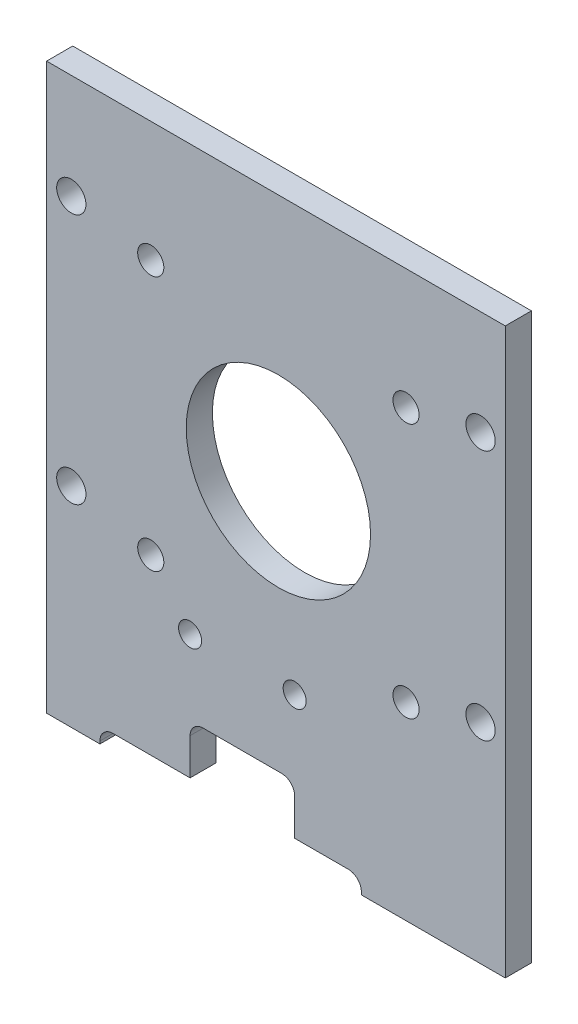
ISO-10303-21;
HEADER;
FILE_DESCRIPTION(('STEP AP214'),'2;1');
FILE_NAME('part.step','',(''),(''),'','','');
FILE_SCHEMA(('AUTOMOTIVE_DESIGN { 1 0 10303 214 1 1 1 1 }'));
ENDSEC;
DATA;
#1=APPLICATION_CONTEXT('core data for automotive mechanical design processes');
#2=APPLICATION_PROTOCOL_DEFINITION('international standard','automotive_design',2000,#1);
#3=PRODUCT_CONTEXT('',#1,'mechanical');
#4=PRODUCT('Part','Part','',(#3));
#5=PRODUCT_RELATED_PRODUCT_CATEGORY('part','',(#4));
#6=PRODUCT_DEFINITION_FORMATION('','',#4);
#7=PRODUCT_DEFINITION_CONTEXT('part definition',#1,'design');
#8=PRODUCT_DEFINITION('design','',#6,#7);
#9=PRODUCT_DEFINITION_SHAPE('','',#8);
#10=(LENGTH_UNIT() NAMED_UNIT(*) SI_UNIT(.MILLI.,.METRE.));
#11=(NAMED_UNIT(*) PLANE_ANGLE_UNIT() SI_UNIT($,.RADIAN.));
#12=(NAMED_UNIT(*) SI_UNIT($,.STERADIAN.) SOLID_ANGLE_UNIT());
#13=UNCERTAINTY_MEASURE_WITH_UNIT(LENGTH_MEASURE(1.E-05),#10,'distance_accuracy_value','');
#14=(GEOMETRIC_REPRESENTATION_CONTEXT(3) GLOBAL_UNCERTAINTY_ASSIGNED_CONTEXT((#13)) GLOBAL_UNIT_ASSIGNED_CONTEXT((#10,
#11,#12)) REPRESENTATION_CONTEXT('',''));
#15=CARTESIAN_POINT('',(0.,0.,0.));
#16=DIRECTION('',(0.,0.,1.));
#17=DIRECTION('',(1.,0.,0.));
#18=AXIS2_PLACEMENT_3D('',#15,#16,#17);
#19=CARTESIAN_POINT('',(0.,0.,3.175));
#20=DIRECTION('',(0.,1.,0.));
#21=DIRECTION('',(0.,0.,1.));
#22=AXIS2_PLACEMENT_3D('',#19,#20,#21);
#23=PLANE('',#22);
#24=DIRECTION('',(1.,0.,0.));
#25=VECTOR('',#24,1.);
#26=CARTESIAN_POINT('',(0.,0.,0.));
#27=LINE('',#26,#25);
#28=CARTESIAN_POINT('',(0.,0.,0.));
#29=VERTEX_POINT('',#28);
#30=CARTESIAN_POINT('',(6.477,0.,0.));
#31=VERTEX_POINT('',#30);
#32=EDGE_CURVE('E150',#29,#31,#27,.T.);
#33=ORIENTED_EDGE('',*,*,#32,.T.);
#34=DIRECTION('',(0.,0.,1.));
#35=VECTOR('',#34,1.);
#36=CARTESIAN_POINT('',(6.477,0.,0.));
#37=LINE('',#36,#35);
#38=CARTESIAN_POINT('',(6.477,0.,3.175));
#39=VERTEX_POINT('',#38);
#40=EDGE_CURVE('E160',#31,#39,#37,.T.);
#41=ORIENTED_EDGE('',*,*,#40,.T.);
#42=DIRECTION('',(1.,0.,0.));
#43=VECTOR('',#42,1.);
#44=CARTESIAN_POINT('',(0.,0.,3.175));
#45=LINE('',#44,#43);
#46=CARTESIAN_POINT('',(0.,0.,3.175));
#47=VERTEX_POINT('',#46);
#48=EDGE_CURVE('E290',#47,#39,#45,.T.);
#49=ORIENTED_EDGE('',*,*,#48,.F.);
#50=DIRECTION('',(0.,0.,-1.));
#51=VECTOR('',#50,1.);
#52=CARTESIAN_POINT('',(0.,0.,3.175));
#53=LINE('',#52,#51);
#54=EDGE_CURVE('E169',#47,#29,#53,.T.);
#55=ORIENTED_EDGE('',*,*,#54,.T.);
#56=EDGE_LOOP('',(#33,#41,#49,#55));
#57=FACE_BOUND('',#56,.T.);
#58=ADVANCED_FACE('F32',(#57),#23,.F.);
#59=CARTESIAN_POINT('',(0.,0.,3.175));
#60=DIRECTION('',(1.,0.,0.));
#61=DIRECTION('',(0.,0.,-1.));
#62=AXIS2_PLACEMENT_3D('',#59,#60,#61);
#63=PLANE('',#62);
#64=DIRECTION('',(0.,-1.,0.));
#65=VECTOR('',#64,1.);
#66=CARTESIAN_POINT('',(0.,0.,0.));
#67=LINE('',#66,#65);
#68=CARTESIAN_POINT('',(0.,68.58,0.));
#69=VERTEX_POINT('',#68);
#70=EDGE_CURVE('E176',#69,#29,#67,.T.);
#71=ORIENTED_EDGE('',*,*,#70,.T.);
#72=ORIENTED_EDGE('',*,*,#54,.F.);
#73=DIRECTION('',(0.,-1.,0.));
#74=VECTOR('',#73,1.);
#75=CARTESIAN_POINT('',(0.,0.,3.175));
#76=LINE('',#75,#74);
#77=CARTESIAN_POINT('',(0.,68.58,3.175));
#78=VERTEX_POINT('',#77);
#79=EDGE_CURVE('E181',#78,#47,#76,.T.);
#80=ORIENTED_EDGE('',*,*,#79,.F.);
#81=DIRECTION('',(0.,0.,-1.));
#82=VECTOR('',#81,1.);
#83=CARTESIAN_POINT('',(0.,68.58,3.175));
#84=LINE('',#83,#82);
#85=EDGE_CURVE('E182',#78,#69,#84,.T.);
#86=ORIENTED_EDGE('',*,*,#85,.T.);
#87=EDGE_LOOP('',(#71,#72,#80,#86));
#88=FACE_BOUND('',#87,.T.);
#89=ADVANCED_FACE('F302',(#88),#63,.F.);
#90=CARTESIAN_POINT('',(38.227,0.,3.175));
#91=VERTEX_POINT('',#90);
#92=CARTESIAN_POINT('',(55.700676,0.,3.175));
#93=VERTEX_POINT('',#92);
#94=EDGE_CURVE('E289',#91,#93,#45,.T.);
#95=ORIENTED_EDGE('',*,*,#94,.F.);
#96=DIRECTION('',(0.,0.,1.));
#97=VECTOR('',#96,1.);
#98=CARTESIAN_POINT('',(38.227,0.,0.));
#99=LINE('',#98,#97);
#100=CARTESIAN_POINT('',(38.227,0.,0.));
#101=VERTEX_POINT('',#100);
#102=EDGE_CURVE('E165',#101,#91,#99,.T.);
#103=ORIENTED_EDGE('',*,*,#102,.F.);
#104=CARTESIAN_POINT('',(55.700676,0.,0.));
#105=VERTEX_POINT('',#104);
#106=EDGE_CURVE('E172',#101,#105,#27,.T.);
#107=ORIENTED_EDGE('',*,*,#106,.T.);
#108=DIRECTION('',(0.,0.,-1.));
#109=VECTOR('',#108,1.);
#110=CARTESIAN_POINT('',(55.700676,0.,3.175));
#111=LINE('',#110,#109);
#112=EDGE_CURVE('E189',#93,#105,#111,.T.);
#113=ORIENTED_EDGE('',*,*,#112,.F.);
#114=EDGE_LOOP('',(#95,#103,#107,#113));
#115=FACE_BOUND('',#114,.T.);
#116=ADVANCED_FACE('F311',(#115),#23,.F.);
#117=CARTESIAN_POINT('',(55.700676,0.,3.175));
#118=DIRECTION('',(-1.,0.,0.));
#119=DIRECTION('',(0.,0.,1.));
#120=AXIS2_PLACEMENT_3D('',#117,#118,#119);
#121=PLANE('',#120);
#122=DIRECTION('',(0.,1.,0.));
#123=VECTOR('',#122,1.);
#124=CARTESIAN_POINT('',(55.700676,0.,0.));
#125=LINE('',#124,#123);
#126=CARTESIAN_POINT('',(55.700676,68.58,0.));
#127=VERTEX_POINT('',#126);
#128=EDGE_CURVE('E171',#105,#127,#125,.T.);
#129=ORIENTED_EDGE('',*,*,#128,.T.);
#130=DIRECTION('',(0.,0.,-1.));
#131=VECTOR('',#130,1.);
#132=CARTESIAN_POINT('',(55.700676,68.58,3.175));
#133=LINE('',#132,#131);
#134=CARTESIAN_POINT('',(55.700676,68.58,3.175));
#135=VERTEX_POINT('',#134);
#136=EDGE_CURVE('E185',#135,#127,#133,.T.);
#137=ORIENTED_EDGE('',*,*,#136,.F.);
#138=DIRECTION('',(0.,1.,0.));
#139=VECTOR('',#138,1.);
#140=CARTESIAN_POINT('',(55.700676,0.,3.175));
#141=LINE('',#140,#139);
#142=EDGE_CURVE('E292',#93,#135,#141,.T.);
#143=ORIENTED_EDGE('',*,*,#142,.F.);
#144=ORIENTED_EDGE('',*,*,#112,.T.);
#145=EDGE_LOOP('',(#129,#137,#143,#144));
#146=FACE_BOUND('',#145,.T.);
#147=ADVANCED_FACE('F307',(#146),#121,.F.);
#148=CARTESIAN_POINT('',(0.,68.58,3.175));
#149=DIRECTION('',(0.,-1.,0.));
#150=DIRECTION('',(0.,0.,-1.));
#151=AXIS2_PLACEMENT_3D('',#148,#149,#150);
#152=PLANE('',#151);
#153=DIRECTION('',(-1.,0.,0.));
#154=VECTOR('',#153,1.);
#155=CARTESIAN_POINT('',(0.,68.58,0.));
#156=LINE('',#155,#154);
#157=EDGE_CURVE('E174',#127,#69,#156,.T.);
#158=ORIENTED_EDGE('',*,*,#157,.T.);
#159=ORIENTED_EDGE('',*,*,#85,.F.);
#160=DIRECTION('',(-1.,0.,0.));
#161=VECTOR('',#160,1.);
#162=CARTESIAN_POINT('',(0.,68.58,3.175));
#163=LINE('',#162,#161);
#164=EDGE_CURVE('E186',#135,#78,#163,.T.);
#165=ORIENTED_EDGE('',*,*,#164,.F.);
#166=ORIENTED_EDGE('',*,*,#136,.T.);
#167=EDGE_LOOP('',(#158,#159,#165,#166));
#168=FACE_BOUND('',#167,.T.);
#169=ADVANCED_FACE('F299',(#168),#152,.F.);
#170=CARTESIAN_POINT('',(0.,68.58,3.175));
#171=DIRECTION('',(0.,0.,-1.));
#172=DIRECTION('',(-1.,0.,0.));
#173=AXIS2_PLACEMENT_3D('',#170,#171,#172);
#174=PLANE('',#173);
#175=CARTESIAN_POINT('',(52.700676,55.88,3.175));
#176=DIRECTION('',(0.,0.,1.));
#177=DIRECTION('',(1.,0.,0.));
#178=AXIS2_PLACEMENT_3D('',#175,#176,#177);
#179=CIRCLE('',#178,1.778);
#180=CARTESIAN_POINT('',(54.478676,55.88,3.175));
#181=VERTEX_POINT('',#180);
#182=EDGE_CURVE('E363',#181,#181,#179,.T.);
#183=ORIENTED_EDGE('',*,*,#182,.F.);
#184=EDGE_LOOP('',(#183));
#185=FACE_BOUND('',#184,.T.);
#186=CARTESIAN_POINT('',(52.700676,25.4,3.175));
#187=DIRECTION('',(0.,0.,1.));
#188=DIRECTION('',(1.,0.,0.));
#189=AXIS2_PLACEMENT_3D('',#186,#187,#188);
#190=CIRCLE('',#189,1.778);
#191=CARTESIAN_POINT('',(54.478676,25.4,3.175));
#192=VERTEX_POINT('',#191);
#193=EDGE_CURVE('E357',#192,#192,#190,.T.);
#194=ORIENTED_EDGE('',*,*,#193,.F.);
#195=EDGE_LOOP('',(#194));
#196=FACE_BOUND('',#195,.T.);
#197=CARTESIAN_POINT('',(3.,25.4,3.175));
#198=DIRECTION('',(0.,0.,1.));
#199=DIRECTION('',(1.,0.,0.));
#200=AXIS2_PLACEMENT_3D('',#197,#198,#199);
#201=CIRCLE('',#200,1.778);
#202=CARTESIAN_POINT('',(4.778,25.4,3.175));
#203=VERTEX_POINT('',#202);
#204=EDGE_CURVE('E351',#203,#203,#201,.T.);
#205=ORIENTED_EDGE('',*,*,#204,.F.);
#206=EDGE_LOOP('',(#205));
#207=FACE_BOUND('',#206,.T.);
#208=CARTESIAN_POINT('',(3.,55.88,3.175));
#209=DIRECTION('',(0.,0.,1.));
#210=DIRECTION('',(1.,0.,0.));
#211=AXIS2_PLACEMENT_3D('',#208,#209,#210);
#212=CIRCLE('',#211,1.778);
#213=CARTESIAN_POINT('',(4.778,55.88,3.175));
#214=VERTEX_POINT('',#213);
#215=EDGE_CURVE('E345',#214,#214,#212,.T.);
#216=ORIENTED_EDGE('',*,*,#215,.F.);
#217=EDGE_LOOP('',(#216));
#218=FACE_BOUND('',#217,.T.);
#219=CARTESIAN_POINT('',(30.1242,17.005299976,3.175));
#220=DIRECTION('',(0.,0.,1.));
#221=DIRECTION('',(1.,0.,0.));
#222=AXIS2_PLACEMENT_3D('',#219,#220,#221);
#223=CIRCLE('',#222,1.397);
#224=CARTESIAN_POINT('',(31.5212,17.005299976,3.175));
#225=VERTEX_POINT('',#224);
#226=EDGE_CURVE('E317',#225,#225,#223,.T.);
#227=ORIENTED_EDGE('',*,*,#226,.F.);
#228=EDGE_LOOP('',(#227));
#229=FACE_BOUND('',#228,.T.);
#230=CARTESIAN_POINT('',(17.4242,17.005299976,3.175));
#231=DIRECTION('',(0.,0.,1.));
#232=DIRECTION('',(1.,0.,0.));
#233=AXIS2_PLACEMENT_3D('',#230,#231,#232);
#234=CIRCLE('',#233,1.397);
#235=CARTESIAN_POINT('',(18.8212,17.005299976,3.175));
#236=VERTEX_POINT('',#235);
#237=EDGE_CURVE('E325',#236,#236,#234,.T.);
#238=ORIENTED_EDGE('',*,*,#237,.F.);
#239=EDGE_LOOP('',(#238));
#240=FACE_BOUND('',#239,.T.);
#241=CARTESIAN_POINT('',(12.6492,22.975,3.175));
#242=DIRECTION('',(0.,0.,1.));
#243=DIRECTION('',(1.,0.,0.));
#244=AXIS2_PLACEMENT_3D('',#241,#242,#243);
#245=CIRCLE('',#244,1.5875);
#246=CARTESIAN_POINT('',(14.2367,22.975,3.175));
#247=VERTEX_POINT('',#246);
#248=EDGE_CURVE('E261',#247,#247,#245,.T.);
#249=ORIENTED_EDGE('',*,*,#248,.F.);
#250=EDGE_LOOP('',(#249));
#251=FACE_BOUND('',#250,.T.);
#252=CARTESIAN_POINT('',(43.6492,22.975,3.175));
#253=DIRECTION('',(0.,0.,1.));
#254=DIRECTION('',(1.,0.,0.));
#255=AXIS2_PLACEMENT_3D('',#252,#253,#254);
#256=CIRCLE('',#255,1.5875);
#257=CARTESIAN_POINT('',(45.2367,22.975,3.175));
#258=VERTEX_POINT('',#257);
#259=EDGE_CURVE('E260',#258,#258,#256,.T.);
#260=ORIENTED_EDGE('',*,*,#259,.F.);
#261=EDGE_LOOP('',(#260));
#262=FACE_BOUND('',#261,.T.);
#263=CARTESIAN_POINT('',(43.6492,53.975,3.175));
#264=DIRECTION('',(0.,0.,1.));
#265=DIRECTION('',(1.,0.,0.));
#266=AXIS2_PLACEMENT_3D('',#263,#264,#265);
#267=CIRCLE('',#266,1.5875);
#268=CARTESIAN_POINT('',(45.2367,53.975,3.175));
#269=VERTEX_POINT('',#268);
#270=EDGE_CURVE('E267',#269,#269,#267,.T.);
#271=ORIENTED_EDGE('',*,*,#270,.F.);
#272=EDGE_LOOP('',(#271));
#273=FACE_BOUND('',#272,.T.);
#274=CARTESIAN_POINT('',(12.6492,53.975,3.175));
#275=DIRECTION('',(0.,0.,1.));
#276=DIRECTION('',(1.,0.,0.));
#277=AXIS2_PLACEMENT_3D('',#274,#275,#276);
#278=CIRCLE('',#277,1.5875);
#279=CARTESIAN_POINT('',(14.2367,53.975,3.175));
#280=VERTEX_POINT('',#279);
#281=EDGE_CURVE('E273',#280,#280,#278,.T.);
#282=ORIENTED_EDGE('',*,*,#281,.F.);
#283=EDGE_LOOP('',(#282));
#284=FACE_BOUND('',#283,.T.);
#285=CARTESIAN_POINT('',(28.1492,38.475,3.175));
#286=DIRECTION('',(0.,0.,1.));
#287=DIRECTION('',(1.,0.,0.));
#288=AXIS2_PLACEMENT_3D('',#285,#286,#287);
#289=CIRCLE('',#288,11.190499971);
#290=CARTESIAN_POINT('',(39.339699971,38.475,3.175));
#291=VERTEX_POINT('',#290);
#292=EDGE_CURVE('E279',#291,#291,#289,.T.);
#293=ORIENTED_EDGE('',*,*,#292,.F.);
#294=EDGE_LOOP('',(#293));
#295=FACE_BOUND('',#294,.T.);
#296=ORIENTED_EDGE('',*,*,#48,.T.);
#297=DIRECTION('',(0.,-1.,0.));
#298=VECTOR('',#297,1.);
#299=CARTESIAN_POINT('',(6.477,0.,3.175));
#300=LINE('',#299,#298);
#301=CARTESIAN_POINT('',(6.477,0.3175,3.175));
#302=VERTEX_POINT('',#301);
#303=EDGE_CURVE('E162',#302,#39,#300,.T.);
#304=ORIENTED_EDGE('',*,*,#303,.F.);
#305=CARTESIAN_POINT('',(8.0645,0.3175,3.175));
#306=DIRECTION('',(0.,0.,-1.));
#307=DIRECTION('',(-1.,0.,0.));
#308=AXIS2_PLACEMENT_3D('',#305,#306,#307);
#309=CIRCLE('',#308,1.5875);
#310=CARTESIAN_POINT('',(8.0645,1.905,3.175));
#311=VERTEX_POINT('',#310);
#312=EDGE_CURVE('E40',#302,#311,#309,.T.);
#313=ORIENTED_EDGE('',*,*,#312,.T.);
#314=DIRECTION('',(-1.,0.,0.));
#315=VECTOR('',#314,1.);
#316=CARTESIAN_POINT('',(6.477,1.905,3.175));
#317=LINE('',#316,#315);
#318=CARTESIAN_POINT('',(17.4242,1.905,3.175));
#319=VERTEX_POINT('',#318);
#320=EDGE_CURVE('E336',#319,#311,#317,.T.);
#321=ORIENTED_EDGE('',*,*,#320,.F.);
#322=DIRECTION('',(0.,-1.,0.));
#323=VECTOR('',#322,1.);
#324=CARTESIAN_POINT('',(17.4242,0.,3.175));
#325=LINE('',#324,#323);
#326=CARTESIAN_POINT('',(17.4242,6.35,3.175));
#327=VERTEX_POINT('',#326);
#328=EDGE_CURVE('E247',#327,#319,#325,.T.);
#329=ORIENTED_EDGE('',*,*,#328,.F.);
#330=CARTESIAN_POINT('',(19.0117,6.35,3.175));
#331=DIRECTION('',(0.,0.,-1.));
#332=DIRECTION('',(-1.,0.,0.));
#333=AXIS2_PLACEMENT_3D('',#330,#331,#332);
#334=CIRCLE('',#333,1.5875);
#335=CARTESIAN_POINT('',(19.0117,7.9375,3.175));
#336=VERTEX_POINT('',#335);
#337=EDGE_CURVE('E222',#327,#336,#334,.T.);
#338=ORIENTED_EDGE('',*,*,#337,.T.);
#339=DIRECTION('',(-1.,0.,0.));
#340=VECTOR('',#339,1.);
#341=CARTESIAN_POINT('',(17.4242,7.9375,3.175));
#342=LINE('',#341,#340);
#343=CARTESIAN_POINT('',(28.5367,7.9375,3.175));
#344=VERTEX_POINT('',#343);
#345=EDGE_CURVE('E241',#344,#336,#342,.T.);
#346=ORIENTED_EDGE('',*,*,#345,.F.);
#347=CARTESIAN_POINT('',(28.5367,6.35,3.175));
#348=DIRECTION('',(0.,0.,-1.));
#349=DIRECTION('',(-1.,0.,0.));
#350=AXIS2_PLACEMENT_3D('',#347,#348,#349);
#351=CIRCLE('',#350,1.5875);
#352=CARTESIAN_POINT('',(30.1242,6.35,3.175));
#353=VERTEX_POINT('',#352);
#354=EDGE_CURVE('E218',#344,#353,#351,.T.);
#355=ORIENTED_EDGE('',*,*,#354,.T.);
#356=DIRECTION('',(0.,1.,0.));
#357=VECTOR('',#356,1.);
#358=CARTESIAN_POINT('',(30.1242,0.,3.175));
#359=LINE('',#358,#357);
#360=CARTESIAN_POINT('',(30.1242,1.905,3.175));
#361=VERTEX_POINT('',#360);
#362=EDGE_CURVE('E251',#361,#353,#359,.T.);
#363=ORIENTED_EDGE('',*,*,#362,.F.);
#364=CARTESIAN_POINT('',(36.6395,1.905,3.175));
#365=VERTEX_POINT('',#364);
#366=EDGE_CURVE('E157',#365,#361,#317,.T.);
#367=ORIENTED_EDGE('',*,*,#366,.F.);
#368=CARTESIAN_POINT('',(36.6395,0.3175,3.175));
#369=DIRECTION('',(0.,0.,-1.));
#370=DIRECTION('',(-1.,0.,0.));
#371=AXIS2_PLACEMENT_3D('',#368,#369,#370);
#372=CIRCLE('',#371,1.5875);
#373=CARTESIAN_POINT('',(38.227,0.3175,3.175));
#374=VERTEX_POINT('',#373);
#375=EDGE_CURVE('E214',#365,#374,#372,.T.);
#376=ORIENTED_EDGE('',*,*,#375,.T.);
#377=DIRECTION('',(0.,1.,0.));
#378=VECTOR('',#377,1.);
#379=CARTESIAN_POINT('',(38.227,0.,3.175));
#380=LINE('',#379,#378);
#381=EDGE_CURVE('E338',#91,#374,#380,.T.);
#382=ORIENTED_EDGE('',*,*,#381,.F.);
#383=ORIENTED_EDGE('',*,*,#94,.T.);
#384=ORIENTED_EDGE('',*,*,#142,.T.);
#385=ORIENTED_EDGE('',*,*,#164,.T.);
#386=ORIENTED_EDGE('',*,*,#79,.T.);
#387=EDGE_LOOP('',(#296,#304,#313,#321,#329,#338,#346,#355,#363,#367,#376,#382,#383,#384,#385,#386));
#388=FACE_BOUND('',#387,.T.);
#389=ADVANCED_FACE('F246',(#185,#196,#207,#218,#229,#240,#251,#262,#273,#284,#295,#388),#174,.F.);
#390=CARTESIAN_POINT('',(0.,68.58,0.));
#391=DIRECTION('',(0.,0.,-1.));
#392=DIRECTION('',(-1.,0.,0.));
#393=AXIS2_PLACEMENT_3D('',#390,#391,#392);
#394=PLANE('',#393);
#395=CARTESIAN_POINT('',(52.700676,55.88,0.));
#396=DIRECTION('',(0.,0.,1.));
#397=DIRECTION('',(1.,0.,0.));
#398=AXIS2_PLACEMENT_3D('',#395,#396,#397);
#399=CIRCLE('',#398,1.778);
#400=CARTESIAN_POINT('',(54.478676,55.88,0.));
#401=VERTEX_POINT('',#400);
#402=EDGE_CURVE('E360',#401,#401,#399,.T.);
#403=ORIENTED_EDGE('',*,*,#402,.T.);
#404=EDGE_LOOP('',(#403));
#405=FACE_BOUND('',#404,.T.);
#406=CARTESIAN_POINT('',(52.700676,25.4,0.));
#407=DIRECTION('',(0.,0.,1.));
#408=DIRECTION('',(1.,0.,0.));
#409=AXIS2_PLACEMENT_3D('',#406,#407,#408);
#410=CIRCLE('',#409,1.778);
#411=CARTESIAN_POINT('',(54.478676,25.4,0.));
#412=VERTEX_POINT('',#411);
#413=EDGE_CURVE('E354',#412,#412,#410,.T.);
#414=ORIENTED_EDGE('',*,*,#413,.T.);
#415=EDGE_LOOP('',(#414));
#416=FACE_BOUND('',#415,.T.);
#417=CARTESIAN_POINT('',(3.,25.4,0.));
#418=DIRECTION('',(0.,0.,1.));
#419=DIRECTION('',(1.,0.,0.));
#420=AXIS2_PLACEMENT_3D('',#417,#418,#419);
#421=CIRCLE('',#420,1.778);
#422=CARTESIAN_POINT('',(4.778,25.4,0.));
#423=VERTEX_POINT('',#422);
#424=EDGE_CURVE('E348',#423,#423,#421,.T.);
#425=ORIENTED_EDGE('',*,*,#424,.T.);
#426=EDGE_LOOP('',(#425));
#427=FACE_BOUND('',#426,.T.);
#428=CARTESIAN_POINT('',(3.,55.88,0.));
#429=DIRECTION('',(0.,0.,1.));
#430=DIRECTION('',(1.,0.,0.));
#431=AXIS2_PLACEMENT_3D('',#428,#429,#430);
#432=CIRCLE('',#431,1.778);
#433=CARTESIAN_POINT('',(4.778,55.88,0.));
#434=VERTEX_POINT('',#433);
#435=EDGE_CURVE('E340',#434,#434,#432,.T.);
#436=ORIENTED_EDGE('',*,*,#435,.T.);
#437=EDGE_LOOP('',(#436));
#438=FACE_BOUND('',#437,.T.);
#439=DIRECTION('',(-1.,0.,0.));
#440=VECTOR('',#439,1.);
#441=CARTESIAN_POINT('',(6.477,1.905,0.));
#442=LINE('',#441,#440);
#443=CARTESIAN_POINT('',(17.4242,1.905,0.));
#444=VERTEX_POINT('',#443);
#445=CARTESIAN_POINT('',(8.0645,1.905,0.));
#446=VERTEX_POINT('',#445);
#447=EDGE_CURVE('E337',#444,#446,#442,.T.);
#448=ORIENTED_EDGE('',*,*,#447,.T.);
#449=CARTESIAN_POINT('',(8.0645,0.3175,0.));
#450=DIRECTION('',(0.,0.,-1.));
#451=DIRECTION('',(-1.,0.,0.));
#452=AXIS2_PLACEMENT_3D('',#449,#450,#451);
#453=CIRCLE('',#452,1.5875);
#454=CARTESIAN_POINT('',(6.477,0.3175,0.));
#455=VERTEX_POINT('',#454);
#456=EDGE_CURVE('E11',#446,#455,#453,.F.);
#457=ORIENTED_EDGE('',*,*,#456,.T.);
#458=DIRECTION('',(0.,-1.,0.));
#459=VECTOR('',#458,1.);
#460=CARTESIAN_POINT('',(6.477,0.,0.));
#461=LINE('',#460,#459);
#462=EDGE_CURVE('E144',#455,#31,#461,.T.);
#463=ORIENTED_EDGE('',*,*,#462,.T.);
#464=ORIENTED_EDGE('',*,*,#32,.F.);
#465=ORIENTED_EDGE('',*,*,#70,.F.);
#466=ORIENTED_EDGE('',*,*,#157,.F.);
#467=ORIENTED_EDGE('',*,*,#128,.F.);
#468=ORIENTED_EDGE('',*,*,#106,.F.);
#469=DIRECTION('',(0.,1.,0.));
#470=VECTOR('',#469,1.);
#471=CARTESIAN_POINT('',(38.227,0.,0.));
#472=LINE('',#471,#470);
#473=CARTESIAN_POINT('',(38.227,0.3175,0.));
#474=VERTEX_POINT('',#473);
#475=EDGE_CURVE('E156',#101,#474,#472,.T.);
#476=ORIENTED_EDGE('',*,*,#475,.T.);
#477=CARTESIAN_POINT('',(36.6395,0.3175,0.));
#478=DIRECTION('',(0.,0.,-1.));
#479=DIRECTION('',(-1.,0.,0.));
#480=AXIS2_PLACEMENT_3D('',#477,#478,#479);
#481=CIRCLE('',#480,1.5875);
#482=CARTESIAN_POINT('',(36.6395,1.905,0.));
#483=VERTEX_POINT('',#482);
#484=EDGE_CURVE('E216',#474,#483,#481,.F.);
#485=ORIENTED_EDGE('',*,*,#484,.T.);
#486=CARTESIAN_POINT('',(30.1242,1.905,0.));
#487=VERTEX_POINT('',#486);
#488=EDGE_CURVE('E166',#483,#487,#442,.T.);
#489=ORIENTED_EDGE('',*,*,#488,.T.);
#490=DIRECTION('',(0.,1.,0.));
#491=VECTOR('',#490,1.);
#492=CARTESIAN_POINT('',(30.1242,0.,0.));
#493=LINE('',#492,#491);
#494=CARTESIAN_POINT('',(30.1242,6.35,0.));
#495=VERTEX_POINT('',#494);
#496=EDGE_CURVE('E240',#487,#495,#493,.T.);
#497=ORIENTED_EDGE('',*,*,#496,.T.);
#498=CARTESIAN_POINT('',(28.5367,6.35,0.));
#499=DIRECTION('',(0.,0.,-1.));
#500=DIRECTION('',(-1.,0.,0.));
#501=AXIS2_PLACEMENT_3D('',#498,#499,#500);
#502=CIRCLE('',#501,1.5875);
#503=CARTESIAN_POINT('',(28.5367,7.9375,0.));
#504=VERTEX_POINT('',#503);
#505=EDGE_CURVE('E220',#495,#504,#502,.F.);
#506=ORIENTED_EDGE('',*,*,#505,.T.);
#507=DIRECTION('',(-1.,0.,0.));
#508=VECTOR('',#507,1.);
#509=CARTESIAN_POINT('',(17.4242,7.9375,0.));
#510=LINE('',#509,#508);
#511=CARTESIAN_POINT('',(19.0117,7.9375,0.));
#512=VERTEX_POINT('',#511);
#513=EDGE_CURVE('E230',#504,#512,#510,.T.);
#514=ORIENTED_EDGE('',*,*,#513,.T.);
#515=CARTESIAN_POINT('',(19.0117,6.35,0.));
#516=DIRECTION('',(0.,0.,-1.));
#517=DIRECTION('',(-1.,0.,0.));
#518=AXIS2_PLACEMENT_3D('',#515,#516,#517);
#519=CIRCLE('',#518,1.5875);
#520=CARTESIAN_POINT('',(17.4242,6.35,0.));
#521=VERTEX_POINT('',#520);
#522=EDGE_CURVE('E224',#512,#521,#519,.F.);
#523=ORIENTED_EDGE('',*,*,#522,.T.);
#524=DIRECTION('',(0.,-1.,0.));
#525=VECTOR('',#524,1.);
#526=CARTESIAN_POINT('',(17.4242,0.,0.));
#527=LINE('',#526,#525);
#528=EDGE_CURVE('E228',#521,#444,#527,.T.);
#529=ORIENTED_EDGE('',*,*,#528,.T.);
#530=EDGE_LOOP('',(#448,#457,#463,#464,#465,#466,#467,#468,#476,#485,#489,#497,#506,#514,#523,#529));
#531=FACE_BOUND('',#530,.T.);
#532=CARTESIAN_POINT('',(30.1242,17.005299976,0.));
#533=DIRECTION('',(0.,0.,1.));
#534=DIRECTION('',(1.,0.,0.));
#535=AXIS2_PLACEMENT_3D('',#532,#533,#534);
#536=CIRCLE('',#535,1.397);
#537=CARTESIAN_POINT('',(31.5212,17.005299976,0.));
#538=VERTEX_POINT('',#537);
#539=EDGE_CURVE('E322',#538,#538,#536,.T.);
#540=ORIENTED_EDGE('',*,*,#539,.T.);
#541=EDGE_LOOP('',(#540));
#542=FACE_BOUND('',#541,.T.);
#543=CARTESIAN_POINT('',(17.4242,17.005299976,0.));
#544=DIRECTION('',(0.,0.,1.));
#545=DIRECTION('',(1.,0.,0.));
#546=AXIS2_PLACEMENT_3D('',#543,#544,#545);
#547=CIRCLE('',#546,1.397);
#548=CARTESIAN_POINT('',(18.8212,17.005299976,0.));
#549=VERTEX_POINT('',#548);
#550=EDGE_CURVE('E328',#549,#549,#547,.T.);
#551=ORIENTED_EDGE('',*,*,#550,.T.);
#552=EDGE_LOOP('',(#551));
#553=FACE_BOUND('',#552,.T.);
#554=CARTESIAN_POINT('',(12.6492,22.975,0.));
#555=DIRECTION('',(0.,0.,1.));
#556=DIRECTION('',(1.,0.,0.));
#557=AXIS2_PLACEMENT_3D('',#554,#555,#556);
#558=CIRCLE('',#557,1.5875);
#559=CARTESIAN_POINT('',(14.2367,22.975,0.));
#560=VERTEX_POINT('',#559);
#561=EDGE_CURVE('E257',#560,#560,#558,.T.);
#562=ORIENTED_EDGE('',*,*,#561,.T.);
#563=EDGE_LOOP('',(#562));
#564=FACE_BOUND('',#563,.T.);
#565=CARTESIAN_POINT('',(43.6492,22.975,0.));
#566=DIRECTION('',(0.,0.,1.));
#567=DIRECTION('',(1.,0.,0.));
#568=AXIS2_PLACEMENT_3D('',#565,#566,#567);
#569=CIRCLE('',#568,1.5875);
#570=CARTESIAN_POINT('',(45.2367,22.975,0.));
#571=VERTEX_POINT('',#570);
#572=EDGE_CURVE('E264',#571,#571,#569,.T.);
#573=ORIENTED_EDGE('',*,*,#572,.T.);
#574=EDGE_LOOP('',(#573));
#575=FACE_BOUND('',#574,.T.);
#576=CARTESIAN_POINT('',(43.6492,53.975,0.));
#577=DIRECTION('',(0.,0.,1.));
#578=DIRECTION('',(1.,0.,0.));
#579=AXIS2_PLACEMENT_3D('',#576,#577,#578);
#580=CIRCLE('',#579,1.5875);
#581=CARTESIAN_POINT('',(45.2367,53.975,0.));
#582=VERTEX_POINT('',#581);
#583=EDGE_CURVE('E270',#582,#582,#580,.T.);
#584=ORIENTED_EDGE('',*,*,#583,.T.);
#585=EDGE_LOOP('',(#584));
#586=FACE_BOUND('',#585,.T.);
#587=CARTESIAN_POINT('',(12.6492,53.975,0.));
#588=DIRECTION('',(0.,0.,1.));
#589=DIRECTION('',(1.,0.,0.));
#590=AXIS2_PLACEMENT_3D('',#587,#588,#589);
#591=CIRCLE('',#590,1.5875);
#592=CARTESIAN_POINT('',(14.2367,53.975,0.));
#593=VERTEX_POINT('',#592);
#594=EDGE_CURVE('E276',#593,#593,#591,.T.);
#595=ORIENTED_EDGE('',*,*,#594,.T.);
#596=EDGE_LOOP('',(#595));
#597=FACE_BOUND('',#596,.T.);
#598=CARTESIAN_POINT('',(28.1492,38.475,0.));
#599=DIRECTION('',(0.,0.,1.));
#600=DIRECTION('',(1.,0.,0.));
#601=AXIS2_PLACEMENT_3D('',#598,#599,#600);
#602=CIRCLE('',#601,11.190499971);
#603=CARTESIAN_POINT('',(39.339699971,38.475,0.));
#604=VERTEX_POINT('',#603);
#605=EDGE_CURVE('E282',#604,#604,#602,.T.);
#606=ORIENTED_EDGE('',*,*,#605,.T.);
#607=EDGE_LOOP('',(#606));
#608=FACE_BOUND('',#607,.T.);
#609=ADVANCED_FACE('F146',(#405,#416,#427,#438,#531,#542,#553,#564,#575,#586,#597,#608),#394,.T.);
#610=CARTESIAN_POINT('',(28.1492,38.475,0.));
#611=DIRECTION('',(0.,0.,1.));
#612=DIRECTION('',(1.,0.,0.));
#613=AXIS2_PLACEMENT_3D('',#610,#611,#612);
#614=CYLINDRICAL_SURFACE('',#613,11.190499971);
#615=ORIENTED_EDGE('',*,*,#605,.F.);
#616=EDGE_LOOP('',(#615));
#617=FACE_BOUND('',#616,.T.);
#618=ORIENTED_EDGE('',*,*,#292,.T.);
#619=EDGE_LOOP('',(#618));
#620=FACE_BOUND('',#619,.T.);
#621=ADVANCED_FACE('F402',(#617,#620),#614,.F.);
#622=CARTESIAN_POINT('',(12.6492,53.975,0.));
#623=DIRECTION('',(0.,0.,1.));
#624=DIRECTION('',(1.,0.,0.));
#625=AXIS2_PLACEMENT_3D('',#622,#623,#624);
#626=CYLINDRICAL_SURFACE('',#625,1.5875);
#627=ORIENTED_EDGE('',*,*,#594,.F.);
#628=EDGE_LOOP('',(#627));
#629=FACE_BOUND('',#628,.T.);
#630=ORIENTED_EDGE('',*,*,#281,.T.);
#631=EDGE_LOOP('',(#630));
#632=FACE_BOUND('',#631,.T.);
#633=ADVANCED_FACE('F404',(#629,#632),#626,.F.);
#634=CARTESIAN_POINT('',(43.6492,53.975,0.));
#635=DIRECTION('',(0.,0.,1.));
#636=DIRECTION('',(1.,0.,0.));
#637=AXIS2_PLACEMENT_3D('',#634,#635,#636);
#638=CYLINDRICAL_SURFACE('',#637,1.5875);
#639=ORIENTED_EDGE('',*,*,#583,.F.);
#640=EDGE_LOOP('',(#639));
#641=FACE_BOUND('',#640,.T.);
#642=ORIENTED_EDGE('',*,*,#270,.T.);
#643=EDGE_LOOP('',(#642));
#644=FACE_BOUND('',#643,.T.);
#645=ADVANCED_FACE('F411',(#641,#644),#638,.F.);
#646=CARTESIAN_POINT('',(43.6492,22.975,0.));
#647=DIRECTION('',(0.,0.,1.));
#648=DIRECTION('',(1.,0.,0.));
#649=AXIS2_PLACEMENT_3D('',#646,#647,#648);
#650=CYLINDRICAL_SURFACE('',#649,1.5875);
#651=ORIENTED_EDGE('',*,*,#572,.F.);
#652=EDGE_LOOP('',(#651));
#653=FACE_BOUND('',#652,.T.);
#654=ORIENTED_EDGE('',*,*,#259,.T.);
#655=EDGE_LOOP('',(#654));
#656=FACE_BOUND('',#655,.T.);
#657=ADVANCED_FACE('F614',(#653,#656),#650,.F.);
#658=CARTESIAN_POINT('',(12.6492,22.975,0.));
#659=DIRECTION('',(0.,0.,1.));
#660=DIRECTION('',(1.,0.,0.));
#661=AXIS2_PLACEMENT_3D('',#658,#659,#660);
#662=CYLINDRICAL_SURFACE('',#661,1.5875);
#663=ORIENTED_EDGE('',*,*,#561,.F.);
#664=EDGE_LOOP('',(#663));
#665=FACE_BOUND('',#664,.T.);
#666=ORIENTED_EDGE('',*,*,#248,.T.);
#667=EDGE_LOOP('',(#666));
#668=FACE_BOUND('',#667,.T.);
#669=ADVANCED_FACE('F452',(#665,#668),#662,.F.);
#670=CARTESIAN_POINT('',(17.4242,0.,0.));
#671=DIRECTION('',(-1.,0.,0.));
#672=DIRECTION('',(0.,-1.,0.));
#673=AXIS2_PLACEMENT_3D('',#670,#671,#672);
#674=PLANE('',#673);
#675=ORIENTED_EDGE('',*,*,#528,.F.);
#676=DIRECTION('',(0.,0.,1.));
#677=VECTOR('',#676,1.);
#678=CARTESIAN_POINT('',(17.4242,6.35,3.175));
#679=LINE('',#678,#677);
#680=EDGE_CURVE('E208',#521,#327,#679,.T.);
#681=ORIENTED_EDGE('',*,*,#680,.T.);
#682=ORIENTED_EDGE('',*,*,#328,.T.);
#683=DIRECTION('',(0.,0.,-1.));
#684=VECTOR('',#683,1.);
#685=CARTESIAN_POINT('',(17.4242,1.905,0.));
#686=LINE('',#685,#684);
#687=EDGE_CURVE('E239',#319,#444,#686,.T.);
#688=ORIENTED_EDGE('',*,*,#687,.T.);
#689=EDGE_LOOP('',(#675,#681,#682,#688));
#690=FACE_BOUND('',#689,.T.);
#691=ADVANCED_FACE('F236',(#690),#674,.F.);
#692=CARTESIAN_POINT('',(17.4242,7.9375,0.));
#693=DIRECTION('',(0.,1.,0.));
#694=DIRECTION('',(-1.,0.,0.));
#695=AXIS2_PLACEMENT_3D('',#692,#693,#694);
#696=PLANE('',#695);
#697=ORIENTED_EDGE('',*,*,#513,.F.);
#698=DIRECTION('',(0.,0.,1.));
#699=VECTOR('',#698,1.);
#700=CARTESIAN_POINT('',(28.5367,7.9375,3.175));
#701=LINE('',#700,#699);
#702=EDGE_CURVE('E203',#504,#344,#701,.T.);
#703=ORIENTED_EDGE('',*,*,#702,.T.);
#704=ORIENTED_EDGE('',*,*,#345,.T.);
#705=DIRECTION('',(0.,0.,1.));
#706=VECTOR('',#705,1.);
#707=CARTESIAN_POINT('',(19.0117,7.9375,0.));
#708=LINE('',#707,#706);
#709=EDGE_CURVE('E201',#336,#512,#708,.F.);
#710=ORIENTED_EDGE('',*,*,#709,.T.);
#711=EDGE_LOOP('',(#697,#703,#704,#710));
#712=FACE_BOUND('',#711,.T.);
#713=ADVANCED_FACE('F249',(#712),#696,.F.);
#714=CARTESIAN_POINT('',(30.1242,0.,0.));
#715=DIRECTION('',(1.,0.,0.));
#716=DIRECTION('',(0.,0.,-1.));
#717=AXIS2_PLACEMENT_3D('',#714,#715,#716);
#718=PLANE('',#717);
#719=ORIENTED_EDGE('',*,*,#362,.T.);
#720=DIRECTION('',(0.,0.,1.));
#721=VECTOR('',#720,1.);
#722=CARTESIAN_POINT('',(30.1242,6.35,0.));
#723=LINE('',#722,#721);
#724=EDGE_CURVE('E206',#353,#495,#723,.F.);
#725=ORIENTED_EDGE('',*,*,#724,.T.);
#726=ORIENTED_EDGE('',*,*,#496,.F.);
#727=DIRECTION('',(0.,0.,1.));
#728=VECTOR('',#727,1.);
#729=CARTESIAN_POINT('',(30.1242,1.905,0.));
#730=LINE('',#729,#728);
#731=EDGE_CURVE('E193',#487,#361,#730,.T.);
#732=ORIENTED_EDGE('',*,*,#731,.T.);
#733=EDGE_LOOP('',(#719,#725,#726,#732));
#734=FACE_BOUND('',#733,.T.);
#735=ADVANCED_FACE('F463',(#734),#718,.F.);
#736=CARTESIAN_POINT('',(17.4242,17.005299976,0.));
#737=DIRECTION('',(0.,0.,1.));
#738=DIRECTION('',(1.,0.,0.));
#739=AXIS2_PLACEMENT_3D('',#736,#737,#738);
#740=CYLINDRICAL_SURFACE('',#739,1.397);
#741=ORIENTED_EDGE('',*,*,#550,.F.);
#742=EDGE_LOOP('',(#741));
#743=FACE_BOUND('',#742,.T.);
#744=ORIENTED_EDGE('',*,*,#237,.T.);
#745=EDGE_LOOP('',(#744));
#746=FACE_BOUND('',#745,.T.);
#747=ADVANCED_FACE('F472',(#743,#746),#740,.F.);
#748=CARTESIAN_POINT('',(30.1242,17.005299976,0.));
#749=DIRECTION('',(0.,0.,1.));
#750=DIRECTION('',(1.,0.,0.));
#751=AXIS2_PLACEMENT_3D('',#748,#749,#750);
#752=CYLINDRICAL_SURFACE('',#751,1.397);
#753=ORIENTED_EDGE('',*,*,#539,.F.);
#754=EDGE_LOOP('',(#753));
#755=FACE_BOUND('',#754,.T.);
#756=ORIENTED_EDGE('',*,*,#226,.T.);
#757=EDGE_LOOP('',(#756));
#758=FACE_BOUND('',#757,.T.);
#759=ADVANCED_FACE('F486',(#755,#758),#752,.F.);
#760=CARTESIAN_POINT('',(6.477,1.905,0.));
#761=DIRECTION('',(0.,1.,0.));
#762=DIRECTION('',(0.,0.,1.));
#763=AXIS2_PLACEMENT_3D('',#760,#761,#762);
#764=PLANE('',#763);
#765=ORIENTED_EDGE('',*,*,#488,.F.);
#766=DIRECTION('',(0.,0.,1.));
#767=VECTOR('',#766,1.);
#768=CARTESIAN_POINT('',(36.6395,1.905,3.175));
#769=LINE('',#768,#767);
#770=EDGE_CURVE('E196',#483,#365,#769,.T.);
#771=ORIENTED_EDGE('',*,*,#770,.T.);
#772=ORIENTED_EDGE('',*,*,#366,.T.);
#773=ORIENTED_EDGE('',*,*,#731,.F.);
#774=EDGE_LOOP('',(#765,#771,#772,#773));
#775=FACE_BOUND('',#774,.T.);
#776=ADVANCED_FACE('F480',(#775),#764,.F.);
#777=CARTESIAN_POINT('',(38.227,0.,0.));
#778=DIRECTION('',(1.,0.,0.));
#779=DIRECTION('',(0.,0.,-1.));
#780=AXIS2_PLACEMENT_3D('',#777,#778,#779);
#781=PLANE('',#780);
#782=ORIENTED_EDGE('',*,*,#381,.T.);
#783=DIRECTION('',(0.,0.,1.));
#784=VECTOR('',#783,1.);
#785=CARTESIAN_POINT('',(38.227,0.3175,0.));
#786=LINE('',#785,#784);
#787=EDGE_CURVE('E199',#374,#474,#786,.F.);
#788=ORIENTED_EDGE('',*,*,#787,.T.);
#789=ORIENTED_EDGE('',*,*,#475,.F.);
#790=ORIENTED_EDGE('',*,*,#102,.T.);
#791=EDGE_LOOP('',(#782,#788,#789,#790));
#792=FACE_BOUND('',#791,.T.);
#793=ADVANCED_FACE('F485',(#792),#781,.F.);
#794=ORIENTED_EDGE('',*,*,#320,.T.);
#795=DIRECTION('',(0.,0.,1.));
#796=VECTOR('',#795,1.);
#797=CARTESIAN_POINT('',(8.0645,1.905,0.));
#798=LINE('',#797,#796);
#799=EDGE_CURVE('E47',#311,#446,#798,.F.);
#800=ORIENTED_EDGE('',*,*,#799,.T.);
#801=ORIENTED_EDGE('',*,*,#447,.F.);
#802=ORIENTED_EDGE('',*,*,#687,.F.);
#803=EDGE_LOOP('',(#794,#800,#801,#802));
#804=FACE_BOUND('',#803,.T.);
#805=ADVANCED_FACE('F335',(#804),#764,.F.);
#806=CARTESIAN_POINT('',(6.477,0.,0.));
#807=DIRECTION('',(-1.,0.,0.));
#808=DIRECTION('',(0.,0.,1.));
#809=AXIS2_PLACEMENT_3D('',#806,#807,#808);
#810=PLANE('',#809);
#811=ORIENTED_EDGE('',*,*,#462,.F.);
#812=DIRECTION('',(0.,0.,1.));
#813=VECTOR('',#812,1.);
#814=CARTESIAN_POINT('',(6.477,0.3175,3.175));
#815=LINE('',#814,#813);
#816=EDGE_CURVE('E211',#455,#302,#815,.T.);
#817=ORIENTED_EDGE('',*,*,#816,.T.);
#818=ORIENTED_EDGE('',*,*,#303,.T.);
#819=ORIENTED_EDGE('',*,*,#40,.F.);
#820=EDGE_LOOP('',(#811,#817,#818,#819));
#821=FACE_BOUND('',#820,.T.);
#822=ADVANCED_FACE('F161',(#821),#810,.F.);
#823=CARTESIAN_POINT('',(3.,55.88,0.));
#824=DIRECTION('',(0.,0.,1.));
#825=DIRECTION('',(1.,0.,0.));
#826=AXIS2_PLACEMENT_3D('',#823,#824,#825);
#827=CYLINDRICAL_SURFACE('',#826,1.778);
#828=ORIENTED_EDGE('',*,*,#435,.F.);
#829=EDGE_LOOP('',(#828));
#830=FACE_BOUND('',#829,.T.);
#831=ORIENTED_EDGE('',*,*,#215,.T.);
#832=EDGE_LOOP('',(#831));
#833=FACE_BOUND('',#832,.T.);
#834=ADVANCED_FACE('F513',(#830,#833),#827,.F.);
#835=CARTESIAN_POINT('',(3.,25.4,0.));
#836=DIRECTION('',(0.,0.,1.));
#837=DIRECTION('',(1.,0.,0.));
#838=AXIS2_PLACEMENT_3D('',#835,#836,#837);
#839=CYLINDRICAL_SURFACE('',#838,1.778);
#840=ORIENTED_EDGE('',*,*,#424,.F.);
#841=EDGE_LOOP('',(#840));
#842=FACE_BOUND('',#841,.T.);
#843=ORIENTED_EDGE('',*,*,#204,.T.);
#844=EDGE_LOOP('',(#843));
#845=FACE_BOUND('',#844,.T.);
#846=ADVANCED_FACE('F569',(#842,#845),#839,.F.);
#847=CARTESIAN_POINT('',(52.700676,25.4,0.));
#848=DIRECTION('',(0.,0.,1.));
#849=DIRECTION('',(1.,0.,0.));
#850=AXIS2_PLACEMENT_3D('',#847,#848,#849);
#851=CYLINDRICAL_SURFACE('',#850,1.778);
#852=ORIENTED_EDGE('',*,*,#413,.F.);
#853=EDGE_LOOP('',(#852));
#854=FACE_BOUND('',#853,.T.);
#855=ORIENTED_EDGE('',*,*,#193,.T.);
#856=EDGE_LOOP('',(#855));
#857=FACE_BOUND('',#856,.T.);
#858=ADVANCED_FACE('F375',(#854,#857),#851,.F.);
#859=CARTESIAN_POINT('',(52.700676,55.88,0.));
#860=DIRECTION('',(0.,0.,1.));
#861=DIRECTION('',(1.,0.,0.));
#862=AXIS2_PLACEMENT_3D('',#859,#860,#861);
#863=CYLINDRICAL_SURFACE('',#862,1.778);
#864=ORIENTED_EDGE('',*,*,#402,.F.);
#865=EDGE_LOOP('',(#864));
#866=FACE_BOUND('',#865,.T.);
#867=ORIENTED_EDGE('',*,*,#182,.T.);
#868=EDGE_LOOP('',(#867));
#869=FACE_BOUND('',#868,.T.);
#870=ADVANCED_FACE('F371',(#866,#869),#863,.F.);
#871=CARTESIAN_POINT('',(36.6395,0.3175,0.));
#872=DIRECTION('',(0.,0.,-1.));
#873=DIRECTION('',(-1.,0.,0.));
#874=AXIS2_PLACEMENT_3D('',#871,#872,#873);
#875=CYLINDRICAL_SURFACE('',#874,1.5875);
#876=ORIENTED_EDGE('',*,*,#484,.F.);
#877=ORIENTED_EDGE('',*,*,#787,.F.);
#878=ORIENTED_EDGE('',*,*,#375,.F.);
#879=ORIENTED_EDGE('',*,*,#770,.F.);
#880=EDGE_LOOP('',(#876,#877,#878,#879));
#881=FACE_BOUND('',#880,.T.);
#882=ADVANCED_FACE('F374',(#881),#875,.F.);
#883=CARTESIAN_POINT('',(28.5367,6.35,0.));
#884=DIRECTION('',(0.,0.,-1.));
#885=DIRECTION('',(-1.,0.,0.));
#886=AXIS2_PLACEMENT_3D('',#883,#884,#885);
#887=CYLINDRICAL_SURFACE('',#886,1.5875);
#888=ORIENTED_EDGE('',*,*,#505,.F.);
#889=ORIENTED_EDGE('',*,*,#724,.F.);
#890=ORIENTED_EDGE('',*,*,#354,.F.);
#891=ORIENTED_EDGE('',*,*,#702,.F.);
#892=EDGE_LOOP('',(#888,#889,#890,#891));
#893=FACE_BOUND('',#892,.T.);
#894=ADVANCED_FACE('F524',(#893),#887,.F.);
#895=CARTESIAN_POINT('',(19.0117,6.35,0.));
#896=DIRECTION('',(0.,0.,-1.));
#897=DIRECTION('',(-1.,0.,0.));
#898=AXIS2_PLACEMENT_3D('',#895,#896,#897);
#899=CYLINDRICAL_SURFACE('',#898,1.5875);
#900=ORIENTED_EDGE('',*,*,#522,.F.);
#901=ORIENTED_EDGE('',*,*,#709,.F.);
#902=ORIENTED_EDGE('',*,*,#337,.F.);
#903=ORIENTED_EDGE('',*,*,#680,.F.);
#904=EDGE_LOOP('',(#900,#901,#902,#903));
#905=FACE_BOUND('',#904,.T.);
#906=ADVANCED_FACE('F243',(#905),#899,.F.);
#907=CARTESIAN_POINT('',(8.0645,0.3175,0.));
#908=DIRECTION('',(0.,0.,-1.));
#909=DIRECTION('',(-1.,0.,0.));
#910=AXIS2_PLACEMENT_3D('',#907,#908,#909);
#911=CYLINDRICAL_SURFACE('',#910,1.5875);
#912=ORIENTED_EDGE('',*,*,#456,.F.);
#913=ORIENTED_EDGE('',*,*,#799,.F.);
#914=ORIENTED_EDGE('',*,*,#312,.F.);
#915=ORIENTED_EDGE('',*,*,#816,.F.);
#916=EDGE_LOOP('',(#912,#913,#914,#915));
#917=FACE_BOUND('',#916,.T.);
#918=ADVANCED_FACE('F34',(#917),#911,.F.);
#919=CLOSED_SHELL('',(#58,#89,#116,#147,#169,#389,#609,#621,#633,#645,#657,#669,#691,#713,#735,
#747,#759,#776,#793,#805,#822,#834,#846,#858,#870,#882,#894,#906,#918));
#920=MANIFOLD_SOLID_BREP('B2',#919);
#921=ADVANCED_BREP_SHAPE_REPRESENTATION('',(#18,#920),#14);
#922=SHAPE_DEFINITION_REPRESENTATION(#9,#921);
ENDSEC;
END-ISO-10303-21;
